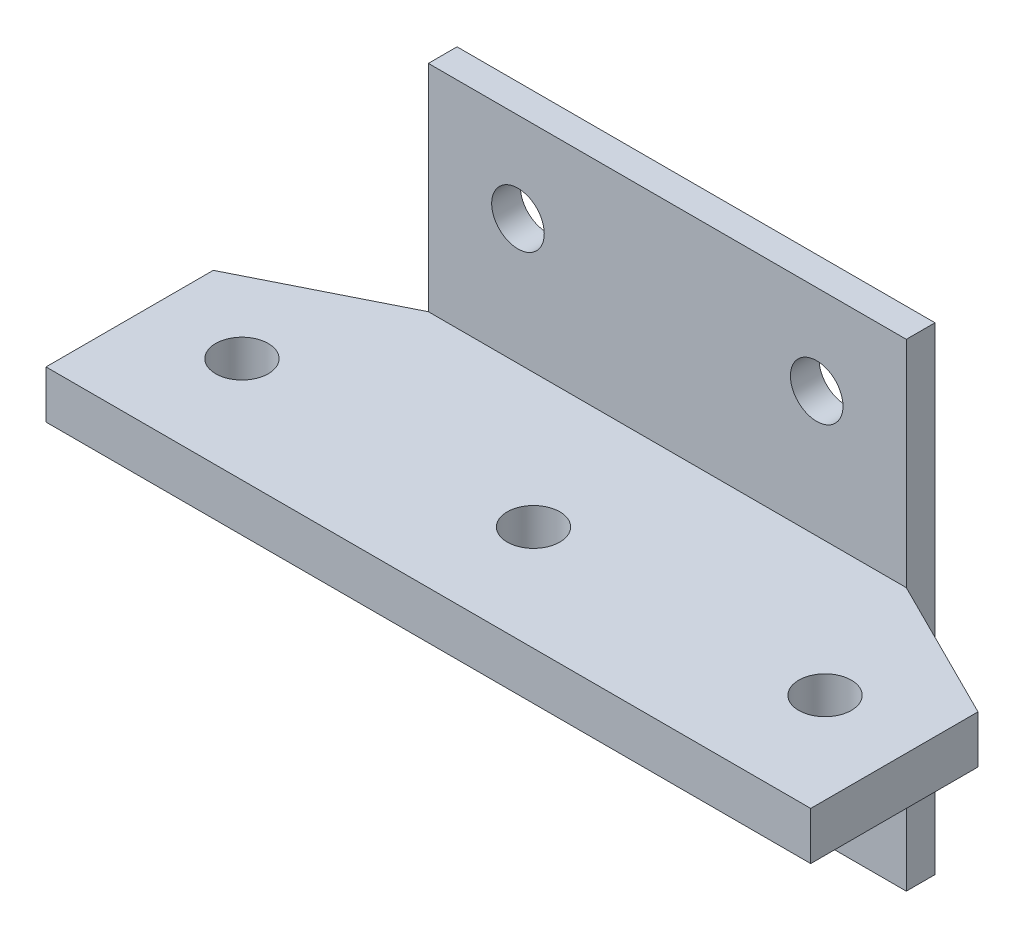
ISO-10303-21;
HEADER;
FILE_DESCRIPTION(('STEP AP214'),'2;1');
FILE_NAME('part.step','',(''),(''),'','','');
FILE_SCHEMA(('AUTOMOTIVE_DESIGN { 1 0 10303 214 1 1 1 1 }'));
ENDSEC;
DATA;
#1=APPLICATION_CONTEXT('core data for automotive mechanical design processes');
#2=APPLICATION_PROTOCOL_DEFINITION('international standard','automotive_design',2000,#1);
#3=PRODUCT_CONTEXT('',#1,'mechanical');
#4=PRODUCT('Part','Part','',(#3));
#5=PRODUCT_RELATED_PRODUCT_CATEGORY('part','',(#4));
#6=PRODUCT_DEFINITION_FORMATION('','',#4);
#7=PRODUCT_DEFINITION_CONTEXT('part definition',#1,'design');
#8=PRODUCT_DEFINITION('design','',#6,#7);
#9=PRODUCT_DEFINITION_SHAPE('','',#8);
#10=(LENGTH_UNIT() NAMED_UNIT(*) SI_UNIT(.MILLI.,.METRE.));
#11=(NAMED_UNIT(*) PLANE_ANGLE_UNIT() SI_UNIT($,.RADIAN.));
#12=(NAMED_UNIT(*) SI_UNIT($,.STERADIAN.) SOLID_ANGLE_UNIT());
#13=UNCERTAINTY_MEASURE_WITH_UNIT(LENGTH_MEASURE(1.E-05),#10,'distance_accuracy_value','');
#14=(GEOMETRIC_REPRESENTATION_CONTEXT(3) GLOBAL_UNCERTAINTY_ASSIGNED_CONTEXT((#13)) GLOBAL_UNIT_ASSIGNED_CONTEXT((#10,
#11,#12)) REPRESENTATION_CONTEXT('',''));
#15=CARTESIAN_POINT('',(0.,0.,0.));
#16=DIRECTION('',(0.,0.,1.));
#17=DIRECTION('',(1.,0.,0.));
#18=AXIS2_PLACEMENT_3D('',#15,#16,#17);
#19=CARTESIAN_POINT('',(0.,200.,12.));
#20=DIRECTION('',(0.,0.,-1.));
#21=DIRECTION('',(-1.,0.,0.));
#22=AXIS2_PLACEMENT_3D('',#19,#20,#21);
#23=PLANE('',#22);
#24=CARTESIAN_POINT('',(162.5,162.5,12.));
#25=DIRECTION('',(0.,0.,1.));
#26=DIRECTION('',(1.,0.,0.));
#27=AXIS2_PLACEMENT_3D('',#24,#25,#26);
#28=CIRCLE('',#27,11.);
#29=CARTESIAN_POINT('',(173.5,162.5,12.));
#30=VERTEX_POINT('',#29);
#31=EDGE_CURVE('E139',#30,#30,#28,.T.);
#32=ORIENTED_EDGE('',*,*,#31,.F.);
#33=EDGE_LOOP('',(#32));
#34=FACE_BOUND('',#33,.T.);
#35=CARTESIAN_POINT('',(37.5,162.5,12.));
#36=DIRECTION('',(0.,0.,1.));
#37=DIRECTION('',(1.,0.,0.));
#38=AXIS2_PLACEMENT_3D('',#35,#36,#37);
#39=CIRCLE('',#38,11.);
#40=CARTESIAN_POINT('',(48.5,162.5,12.));
#41=VERTEX_POINT('',#40);
#42=EDGE_CURVE('E180',#41,#41,#39,.T.);
#43=ORIENTED_EDGE('',*,*,#42,.F.);
#44=EDGE_LOOP('',(#43));
#45=FACE_BOUND('',#44,.T.);
#46=DIRECTION('',(-1.,0.,0.));
#47=VECTOR('',#46,1.);
#48=CARTESIAN_POINT('',(-60.,110.,12.));
#49=LINE('',#48,#47);
#50=CARTESIAN_POINT('',(200.,110.,12.));
#51=VERTEX_POINT('',#50);
#52=CARTESIAN_POINT('',(0.,110.,12.));
#53=VERTEX_POINT('',#52);
#54=EDGE_CURVE('E138',#51,#53,#49,.T.);
#55=ORIENTED_EDGE('',*,*,#54,.F.);
#56=DIRECTION('',(0.,1.,0.));
#57=VECTOR('',#56,1.);
#58=CARTESIAN_POINT('',(200.,0.,12.));
#59=LINE('',#58,#57);
#60=CARTESIAN_POINT('',(200.,200.,12.));
#61=VERTEX_POINT('',#60);
#62=EDGE_CURVE('E155',#51,#61,#59,.T.);
#63=ORIENTED_EDGE('',*,*,#62,.T.);
#64=DIRECTION('',(-1.,0.,0.));
#65=VECTOR('',#64,1.);
#66=CARTESIAN_POINT('',(0.,200.,12.));
#67=LINE('',#66,#65);
#68=CARTESIAN_POINT('',(0.,200.,12.));
#69=VERTEX_POINT('',#68);
#70=EDGE_CURVE('E159',#61,#69,#67,.T.);
#71=ORIENTED_EDGE('',*,*,#70,.T.);
#72=DIRECTION('',(0.,-1.,0.));
#73=VECTOR('',#72,1.);
#74=CARTESIAN_POINT('',(0.,0.,12.));
#75=LINE('',#74,#73);
#76=EDGE_CURVE('E117',#69,#53,#75,.T.);
#77=ORIENTED_EDGE('',*,*,#76,.T.);
#78=EDGE_LOOP('',(#55,#63,#71,#77));
#79=FACE_BOUND('',#78,.T.);
#80=ADVANCED_FACE('F33',(#34,#45,#79),#23,.F.);
#81=CARTESIAN_POINT('',(37.5,37.5,12.));
#82=DIRECTION('',(0.,0.,1.));
#83=DIRECTION('',(1.,0.,0.));
#84=AXIS2_PLACEMENT_3D('',#81,#82,#83);
#85=CIRCLE('',#84,11.);
#86=CARTESIAN_POINT('',(48.5,37.5,12.));
#87=VERTEX_POINT('',#86);
#88=EDGE_CURVE('E368',#87,#87,#85,.T.);
#89=ORIENTED_EDGE('',*,*,#88,.F.);
#90=EDGE_LOOP('',(#89));
#91=FACE_BOUND('',#90,.T.);
#92=CARTESIAN_POINT('',(162.5,37.5,12.));
#93=DIRECTION('',(0.,0.,1.));
#94=DIRECTION('',(1.,0.,0.));
#95=AXIS2_PLACEMENT_3D('',#92,#93,#94);
#96=CIRCLE('',#95,11.);
#97=CARTESIAN_POINT('',(173.5,37.5,12.));
#98=VERTEX_POINT('',#97);
#99=EDGE_CURVE('E359',#98,#98,#96,.T.);
#100=ORIENTED_EDGE('',*,*,#99,.F.);
#101=EDGE_LOOP('',(#100));
#102=FACE_BOUND('',#101,.T.);
#103=DIRECTION('',(1.,0.,0.));
#104=VECTOR('',#103,1.);
#105=CARTESIAN_POINT('',(-60.,90.,12.));
#106=LINE('',#105,#104);
#107=CARTESIAN_POINT('',(0.,90.,12.));
#108=VERTEX_POINT('',#107);
#109=CARTESIAN_POINT('',(200.,90.,12.));
#110=VERTEX_POINT('',#109);
#111=EDGE_CURVE('E127',#108,#110,#106,.T.);
#112=ORIENTED_EDGE('',*,*,#111,.F.);
#113=CARTESIAN_POINT('',(0.,0.,12.));
#114=VERTEX_POINT('',#113);
#115=EDGE_CURVE('E118',#108,#114,#75,.T.);
#116=ORIENTED_EDGE('',*,*,#115,.T.);
#117=DIRECTION('',(1.,0.,0.));
#118=VECTOR('',#117,1.);
#119=CARTESIAN_POINT('',(0.,0.,12.));
#120=LINE('',#119,#118);
#121=CARTESIAN_POINT('',(200.,0.,12.));
#122=VERTEX_POINT('',#121);
#123=EDGE_CURVE('E151',#114,#122,#120,.T.);
#124=ORIENTED_EDGE('',*,*,#123,.T.);
#125=EDGE_CURVE('E137',#122,#110,#59,.T.);
#126=ORIENTED_EDGE('',*,*,#125,.T.);
#127=EDGE_LOOP('',(#112,#116,#124,#126));
#128=FACE_BOUND('',#127,.T.);
#129=ADVANCED_FACE('F134',(#91,#102,#128),#23,.F.);
#130=CARTESIAN_POINT('',(0.,0.,12.));
#131=DIRECTION('',(1.,0.,0.));
#132=DIRECTION('',(0.,0.,-1.));
#133=AXIS2_PLACEMENT_3D('',#130,#131,#132);
#134=PLANE('',#133);
#135=DIRECTION('',(0.,-1.,0.));
#136=VECTOR('',#135,1.);
#137=CARTESIAN_POINT('',(0.,0.,0.));
#138=LINE('',#137,#136);
#139=CARTESIAN_POINT('',(0.,200.,0.));
#140=VERTEX_POINT('',#139);
#141=CARTESIAN_POINT('',(0.,0.,0.));
#142=VERTEX_POINT('',#141);
#143=EDGE_CURVE('E162',#140,#142,#138,.T.);
#144=ORIENTED_EDGE('',*,*,#143,.T.);
#145=DIRECTION('',(0.,0.,-1.));
#146=VECTOR('',#145,1.);
#147=CARTESIAN_POINT('',(0.,0.,12.));
#148=LINE('',#147,#146);
#149=EDGE_CURVE('E145',#114,#142,#148,.T.);
#150=ORIENTED_EDGE('',*,*,#149,.F.);
#151=ORIENTED_EDGE('',*,*,#115,.F.);
#152=EDGE_CURVE('E108',#53,#108,#75,.T.);
#153=ORIENTED_EDGE('',*,*,#152,.F.);
#154=ORIENTED_EDGE('',*,*,#76,.F.);
#155=DIRECTION('',(0.,0.,-1.));
#156=VECTOR('',#155,1.);
#157=CARTESIAN_POINT('',(0.,200.,12.));
#158=LINE('',#157,#156);
#159=EDGE_CURVE('E161',#69,#140,#158,.T.);
#160=ORIENTED_EDGE('',*,*,#159,.T.);
#161=EDGE_LOOP('',(#144,#150,#151,#153,#154,#160));
#162=FACE_BOUND('',#161,.T.);
#163=ADVANCED_FACE('F143',(#162),#134,.F.);
#164=CARTESIAN_POINT('',(0.,0.,12.));
#165=DIRECTION('',(0.,1.,0.));
#166=DIRECTION('',(0.,0.,1.));
#167=AXIS2_PLACEMENT_3D('',#164,#165,#166);
#168=PLANE('',#167);
#169=DIRECTION('',(1.,0.,0.));
#170=VECTOR('',#169,1.);
#171=CARTESIAN_POINT('',(0.,0.,0.));
#172=LINE('',#171,#170);
#173=CARTESIAN_POINT('',(200.,0.,0.));
#174=VERTEX_POINT('',#173);
#175=EDGE_CURVE('E164',#142,#174,#172,.T.);
#176=ORIENTED_EDGE('',*,*,#175,.T.);
#177=DIRECTION('',(0.,0.,-1.));
#178=VECTOR('',#177,1.);
#179=CARTESIAN_POINT('',(200.,0.,12.));
#180=LINE('',#179,#178);
#181=EDGE_CURVE('E173',#122,#174,#180,.T.);
#182=ORIENTED_EDGE('',*,*,#181,.F.);
#183=ORIENTED_EDGE('',*,*,#123,.F.);
#184=ORIENTED_EDGE('',*,*,#149,.T.);
#185=EDGE_LOOP('',(#176,#182,#183,#184));
#186=FACE_BOUND('',#185,.T.);
#187=ADVANCED_FACE('F238',(#186),#168,.F.);
#188=CARTESIAN_POINT('',(200.,0.,12.));
#189=DIRECTION('',(-1.,0.,0.));
#190=DIRECTION('',(0.,0.,1.));
#191=AXIS2_PLACEMENT_3D('',#188,#189,#190);
#192=PLANE('',#191);
#193=DIRECTION('',(0.,1.,0.));
#194=VECTOR('',#193,1.);
#195=CARTESIAN_POINT('',(200.,0.,0.));
#196=LINE('',#195,#194);
#197=CARTESIAN_POINT('',(200.,200.,0.));
#198=VERTEX_POINT('',#197);
#199=EDGE_CURVE('E147',#174,#198,#196,.T.);
#200=ORIENTED_EDGE('',*,*,#199,.T.);
#201=DIRECTION('',(0.,0.,-1.));
#202=VECTOR('',#201,1.);
#203=CARTESIAN_POINT('',(200.,200.,12.));
#204=LINE('',#203,#202);
#205=EDGE_CURVE('E170',#61,#198,#204,.T.);
#206=ORIENTED_EDGE('',*,*,#205,.F.);
#207=ORIENTED_EDGE('',*,*,#62,.F.);
#208=EDGE_CURVE('E56',#110,#51,#59,.T.);
#209=ORIENTED_EDGE('',*,*,#208,.F.);
#210=ORIENTED_EDGE('',*,*,#125,.F.);
#211=ORIENTED_EDGE('',*,*,#181,.T.);
#212=EDGE_LOOP('',(#200,#206,#207,#209,#210,#211));
#213=FACE_BOUND('',#212,.T.);
#214=ADVANCED_FACE('F234',(#213),#192,.F.);
#215=CARTESIAN_POINT('',(0.,200.,12.));
#216=DIRECTION('',(0.,-1.,0.));
#217=DIRECTION('',(0.,0.,-1.));
#218=AXIS2_PLACEMENT_3D('',#215,#216,#217);
#219=PLANE('',#218);
#220=DIRECTION('',(-1.,0.,0.));
#221=VECTOR('',#220,1.);
#222=CARTESIAN_POINT('',(0.,200.,0.));
#223=LINE('',#222,#221);
#224=EDGE_CURVE('E146',#198,#140,#223,.T.);
#225=ORIENTED_EDGE('',*,*,#224,.T.);
#226=ORIENTED_EDGE('',*,*,#159,.F.);
#227=ORIENTED_EDGE('',*,*,#70,.F.);
#228=ORIENTED_EDGE('',*,*,#205,.T.);
#229=EDGE_LOOP('',(#225,#226,#227,#228));
#230=FACE_BOUND('',#229,.T.);
#231=ADVANCED_FACE('F230',(#230),#219,.F.);
#232=CARTESIAN_POINT('',(0.,200.,0.));
#233=DIRECTION('',(0.,0.,-1.));
#234=DIRECTION('',(-1.,0.,0.));
#235=AXIS2_PLACEMENT_3D('',#232,#233,#234);
#236=PLANE('',#235);
#237=CARTESIAN_POINT('',(162.5,37.5,0.));
#238=DIRECTION('',(0.,0.,1.));
#239=DIRECTION('',(1.,0.,0.));
#240=AXIS2_PLACEMENT_3D('',#237,#238,#239);
#241=CIRCLE('',#240,11.);
#242=CARTESIAN_POINT('',(173.5,37.5,0.));
#243=VERTEX_POINT('',#242);
#244=EDGE_CURVE('E355',#243,#243,#241,.T.);
#245=ORIENTED_EDGE('',*,*,#244,.T.);
#246=EDGE_LOOP('',(#245));
#247=FACE_BOUND('',#246,.T.);
#248=CARTESIAN_POINT('',(37.5,37.5,0.));
#249=DIRECTION('',(0.,0.,1.));
#250=DIRECTION('',(1.,0.,0.));
#251=AXIS2_PLACEMENT_3D('',#248,#249,#250);
#252=CIRCLE('',#251,11.);
#253=CARTESIAN_POINT('',(48.5,37.5,0.));
#254=VERTEX_POINT('',#253);
#255=EDGE_CURVE('E165',#254,#254,#252,.T.);
#256=ORIENTED_EDGE('',*,*,#255,.T.);
#257=EDGE_LOOP('',(#256));
#258=FACE_BOUND('',#257,.T.);
#259=ORIENTED_EDGE('',*,*,#143,.F.);
#260=ORIENTED_EDGE('',*,*,#224,.F.);
#261=ORIENTED_EDGE('',*,*,#199,.F.);
#262=ORIENTED_EDGE('',*,*,#175,.F.);
#263=EDGE_LOOP('',(#259,#260,#261,#262));
#264=FACE_BOUND('',#263,.T.);
#265=CARTESIAN_POINT('',(37.5,162.5,0.));
#266=DIRECTION('',(0.,0.,1.));
#267=DIRECTION('',(1.,0.,0.));
#268=AXIS2_PLACEMENT_3D('',#265,#266,#267);
#269=CIRCLE('',#268,11.);
#270=CARTESIAN_POINT('',(48.5,162.5,0.));
#271=VERTEX_POINT('',#270);
#272=EDGE_CURVE('E177',#271,#271,#269,.T.);
#273=ORIENTED_EDGE('',*,*,#272,.T.);
#274=EDGE_LOOP('',(#273));
#275=FACE_BOUND('',#274,.T.);
#276=CARTESIAN_POINT('',(162.5,162.5,0.));
#277=DIRECTION('',(0.,0.,1.));
#278=DIRECTION('',(1.,0.,0.));
#279=AXIS2_PLACEMENT_3D('',#276,#277,#278);
#280=CIRCLE('',#279,11.);
#281=CARTESIAN_POINT('',(173.5,162.5,0.));
#282=VERTEX_POINT('',#281);
#283=EDGE_CURVE('E183',#282,#282,#280,.T.);
#284=ORIENTED_EDGE('',*,*,#283,.T.);
#285=EDGE_LOOP('',(#284));
#286=FACE_BOUND('',#285,.T.);
#287=ADVANCED_FACE('F227',(#247,#258,#264,#275,#286),#236,.T.);
#288=CARTESIAN_POINT('',(37.5,37.5,0.));
#289=DIRECTION('',(0.,0.,1.));
#290=DIRECTION('',(1.,0.,0.));
#291=AXIS2_PLACEMENT_3D('',#288,#289,#290);
#292=CYLINDRICAL_SURFACE('',#291,11.);
#293=ORIENTED_EDGE('',*,*,#255,.F.);
#294=EDGE_LOOP('',(#293));
#295=FACE_BOUND('',#294,.T.);
#296=ORIENTED_EDGE('',*,*,#88,.T.);
#297=EDGE_LOOP('',(#296));
#298=FACE_BOUND('',#297,.T.);
#299=ADVANCED_FACE('F225',(#295,#298),#292,.F.);
#300=CARTESIAN_POINT('',(162.5,37.5,0.));
#301=DIRECTION('',(0.,0.,1.));
#302=DIRECTION('',(1.,0.,0.));
#303=AXIS2_PLACEMENT_3D('',#300,#301,#302);
#304=CYLINDRICAL_SURFACE('',#303,11.);
#305=ORIENTED_EDGE('',*,*,#244,.F.);
#306=EDGE_LOOP('',(#305));
#307=FACE_BOUND('',#306,.T.);
#308=ORIENTED_EDGE('',*,*,#99,.T.);
#309=EDGE_LOOP('',(#308));
#310=FACE_BOUND('',#309,.T.);
#311=ADVANCED_FACE('F247',(#307,#310),#304,.F.);
#312=CARTESIAN_POINT('',(37.5,162.5,0.));
#313=DIRECTION('',(0.,0.,1.));
#314=DIRECTION('',(1.,0.,0.));
#315=AXIS2_PLACEMENT_3D('',#312,#313,#314);
#316=CYLINDRICAL_SURFACE('',#315,11.);
#317=ORIENTED_EDGE('',*,*,#272,.F.);
#318=EDGE_LOOP('',(#317));
#319=FACE_BOUND('',#318,.T.);
#320=ORIENTED_EDGE('',*,*,#42,.T.);
#321=EDGE_LOOP('',(#320));
#322=FACE_BOUND('',#321,.T.);
#323=ADVANCED_FACE('F245',(#319,#322),#316,.F.);
#324=CARTESIAN_POINT('',(162.5,162.5,0.));
#325=DIRECTION('',(0.,0.,1.));
#326=DIRECTION('',(1.,0.,0.));
#327=AXIS2_PLACEMENT_3D('',#324,#325,#326);
#328=CYLINDRICAL_SURFACE('',#327,11.);
#329=ORIENTED_EDGE('',*,*,#283,.F.);
#330=EDGE_LOOP('',(#329));
#331=FACE_BOUND('',#330,.T.);
#332=ORIENTED_EDGE('',*,*,#31,.T.);
#333=EDGE_LOOP('',(#332));
#334=FACE_BOUND('',#333,.T.);
#335=ADVANCED_FACE('F209',(#331,#334),#328,.F.);
#336=CARTESIAN_POINT('',(-60.,110.,112.));
#337=DIRECTION('',(1.,0.,0.));
#338=DIRECTION('',(0.,0.,-1.));
#339=AXIS2_PLACEMENT_3D('',#336,#337,#338);
#340=PLANE('',#339);
#341=DIRECTION('',(0.,0.,-1.));
#342=VECTOR('',#341,1.);
#343=CARTESIAN_POINT('',(-60.,110.,112.));
#344=LINE('',#343,#342);
#345=CARTESIAN_POINT('',(-60.,110.,112.));
#346=VERTEX_POINT('',#345);
#347=CARTESIAN_POINT('',(-60.,110.,42.));
#348=VERTEX_POINT('',#347);
#349=EDGE_CURVE('E400',#346,#348,#344,.T.);
#350=ORIENTED_EDGE('',*,*,#349,.T.);
#351=DIRECTION('',(0.,-1.,0.));
#352=VECTOR('',#351,1.);
#353=CARTESIAN_POINT('',(-60.,200.,42.));
#354=LINE('',#353,#352);
#355=CARTESIAN_POINT('',(-60.,90.,42.));
#356=VERTEX_POINT('',#355);
#357=EDGE_CURVE('E48',#348,#356,#354,.T.);
#358=ORIENTED_EDGE('',*,*,#357,.T.);
#359=DIRECTION('',(0.,0.,-1.));
#360=VECTOR('',#359,1.);
#361=CARTESIAN_POINT('',(-60.,90.,112.));
#362=LINE('',#361,#360);
#363=CARTESIAN_POINT('',(-60.,90.,112.));
#364=VERTEX_POINT('',#363);
#365=EDGE_CURVE('E129',#364,#356,#362,.T.);
#366=ORIENTED_EDGE('',*,*,#365,.F.);
#367=DIRECTION('',(0.,-1.,0.));
#368=VECTOR('',#367,1.);
#369=CARTESIAN_POINT('',(-60.,110.,112.));
#370=LINE('',#369,#368);
#371=EDGE_CURVE('E346',#346,#364,#370,.T.);
#372=ORIENTED_EDGE('',*,*,#371,.F.);
#373=EDGE_LOOP('',(#350,#358,#366,#372));
#374=FACE_BOUND('',#373,.T.);
#375=ADVANCED_FACE('F199',(#374),#340,.F.);
#376=CARTESIAN_POINT('',(-60.,90.,112.));
#377=DIRECTION('',(0.,1.,0.));
#378=DIRECTION('',(0.,0.,1.));
#379=AXIS2_PLACEMENT_3D('',#376,#377,#378);
#380=PLANE('',#379);
#381=CARTESIAN_POINT('',(100.,90.,68.));
#382=DIRECTION('',(0.,-1.,0.));
#383=DIRECTION('',(0.,0.,-1.));
#384=AXIS2_PLACEMENT_3D('',#381,#382,#383);
#385=CIRCLE('',#384,11.);
#386=CARTESIAN_POINT('',(100.,90.,57.));
#387=VERTEX_POINT('',#386);
#388=EDGE_CURVE('E419',#387,#387,#385,.T.);
#389=ORIENTED_EDGE('',*,*,#388,.F.);
#390=EDGE_LOOP('',(#389));
#391=FACE_BOUND('',#390,.T.);
#392=CARTESIAN_POINT('',(-22.,90.,68.));
#393=DIRECTION('',(0.,-1.,0.));
#394=DIRECTION('',(0.,0.,-1.));
#395=AXIS2_PLACEMENT_3D('',#392,#393,#394);
#396=CIRCLE('',#395,11.);
#397=CARTESIAN_POINT('',(-22.,90.,57.));
#398=VERTEX_POINT('',#397);
#399=EDGE_CURVE('E192',#398,#398,#396,.T.);
#400=ORIENTED_EDGE('',*,*,#399,.F.);
#401=EDGE_LOOP('',(#400));
#402=FACE_BOUND('',#401,.T.);
#403=ORIENTED_EDGE('',*,*,#365,.T.);
#404=DIRECTION('',(-0.894427190999916,0.,0.447213595499958));
#405=VECTOR('',#404,1.);
#406=CARTESIAN_POINT('',(-60.,90.,42.));
#407=LINE('',#406,#405);
#408=EDGE_CURVE('E111',#108,#356,#407,.T.);
#409=ORIENTED_EDGE('',*,*,#408,.F.);
#410=ORIENTED_EDGE('',*,*,#111,.T.);
#411=DIRECTION('',(-0.894427190999916,0.,-0.447213595499958));
#412=VECTOR('',#411,1.);
#413=CARTESIAN_POINT('',(200.,90.,12.));
#414=LINE('',#413,#412);
#415=CARTESIAN_POINT('',(260.,90.,42.));
#416=VERTEX_POINT('',#415);
#417=EDGE_CURVE('E407',#416,#110,#414,.T.);
#418=ORIENTED_EDGE('',*,*,#417,.F.);
#419=DIRECTION('',(0.,0.,-1.));
#420=VECTOR('',#419,1.);
#421=CARTESIAN_POINT('',(260.,90.,112.));
#422=LINE('',#421,#420);
#423=CARTESIAN_POINT('',(260.,90.,112.));
#424=VERTEX_POINT('',#423);
#425=EDGE_CURVE('E356',#424,#416,#422,.T.);
#426=ORIENTED_EDGE('',*,*,#425,.F.);
#427=DIRECTION('',(1.,0.,0.));
#428=VECTOR('',#427,1.);
#429=CARTESIAN_POINT('',(-60.,90.,112.));
#430=LINE('',#429,#428);
#431=EDGE_CURVE('E347',#364,#424,#430,.T.);
#432=ORIENTED_EDGE('',*,*,#431,.F.);
#433=EDGE_LOOP('',(#403,#409,#410,#418,#426,#432));
#434=FACE_BOUND('',#433,.T.);
#435=CARTESIAN_POINT('',(222.,90.,68.));
#436=DIRECTION('',(0.,-1.,0.));
#437=DIRECTION('',(0.,0.,-1.));
#438=AXIS2_PLACEMENT_3D('',#435,#436,#437);
#439=CIRCLE('',#438,11.);
#440=CARTESIAN_POINT('',(222.,90.,57.));
#441=VERTEX_POINT('',#440);
#442=EDGE_CURVE('E41',#441,#441,#439,.T.);
#443=ORIENTED_EDGE('',*,*,#442,.F.);
#444=EDGE_LOOP('',(#443));
#445=FACE_BOUND('',#444,.T.);
#446=ADVANCED_FACE('F124',(#391,#402,#434,#445),#380,.F.);
#447=CARTESIAN_POINT('',(260.,110.,112.));
#448=DIRECTION('',(-1.,0.,0.));
#449=DIRECTION('',(0.,0.,1.));
#450=AXIS2_PLACEMENT_3D('',#447,#448,#449);
#451=PLANE('',#450);
#452=ORIENTED_EDGE('',*,*,#425,.T.);
#453=DIRECTION('',(0.,-1.,0.));
#454=VECTOR('',#453,1.);
#455=CARTESIAN_POINT('',(260.,200.,42.));
#456=LINE('',#455,#454);
#457=CARTESIAN_POINT('',(260.,110.,42.));
#458=VERTEX_POINT('',#457);
#459=EDGE_CURVE('E353',#458,#416,#456,.T.);
#460=ORIENTED_EDGE('',*,*,#459,.F.);
#461=DIRECTION('',(0.,0.,-1.));
#462=VECTOR('',#461,1.);
#463=CARTESIAN_POINT('',(260.,110.,112.));
#464=LINE('',#463,#462);
#465=CARTESIAN_POINT('',(260.,110.,112.));
#466=VERTEX_POINT('',#465);
#467=EDGE_CURVE('E362',#466,#458,#464,.T.);
#468=ORIENTED_EDGE('',*,*,#467,.F.);
#469=DIRECTION('',(0.,1.,0.));
#470=VECTOR('',#469,1.);
#471=CARTESIAN_POINT('',(260.,110.,112.));
#472=LINE('',#471,#470);
#473=EDGE_CURVE('E406',#424,#466,#472,.T.);
#474=ORIENTED_EDGE('',*,*,#473,.F.);
#475=EDGE_LOOP('',(#452,#460,#468,#474));
#476=FACE_BOUND('',#475,.T.);
#477=ADVANCED_FACE('F198',(#476),#451,.F.);
#478=CARTESIAN_POINT('',(-60.,110.,112.));
#479=DIRECTION('',(0.,-1.,0.));
#480=DIRECTION('',(0.,0.,-1.));
#481=AXIS2_PLACEMENT_3D('',#478,#479,#480);
#482=PLANE('',#481);
#483=CARTESIAN_POINT('',(100.,110.,68.));
#484=DIRECTION('',(0.,-1.,0.));
#485=DIRECTION('',(0.,0.,-1.));
#486=AXIS2_PLACEMENT_3D('',#483,#484,#485);
#487=CIRCLE('',#486,11.);
#488=CARTESIAN_POINT('',(100.,110.,57.));
#489=VERTEX_POINT('',#488);
#490=EDGE_CURVE('E416',#489,#489,#487,.T.);
#491=ORIENTED_EDGE('',*,*,#490,.T.);
#492=EDGE_LOOP('',(#491));
#493=FACE_BOUND('',#492,.T.);
#494=CARTESIAN_POINT('',(-22.,110.,68.));
#495=DIRECTION('',(0.,-1.,0.));
#496=DIRECTION('',(0.,0.,-1.));
#497=AXIS2_PLACEMENT_3D('',#494,#495,#496);
#498=CIRCLE('',#497,11.);
#499=CARTESIAN_POINT('',(-22.,110.,57.));
#500=VERTEX_POINT('',#499);
#501=EDGE_CURVE('E130',#500,#500,#498,.T.);
#502=ORIENTED_EDGE('',*,*,#501,.T.);
#503=EDGE_LOOP('',(#502));
#504=FACE_BOUND('',#503,.T.);
#505=ORIENTED_EDGE('',*,*,#54,.T.);
#506=DIRECTION('',(-0.894427190999916,0.,0.447213595499958));
#507=VECTOR('',#506,1.);
#508=CARTESIAN_POINT('',(-88.,110.,56.));
#509=LINE('',#508,#507);
#510=EDGE_CURVE('E112',#53,#348,#509,.T.);
#511=ORIENTED_EDGE('',*,*,#510,.T.);
#512=ORIENTED_EDGE('',*,*,#349,.F.);
#513=DIRECTION('',(-1.,0.,0.));
#514=VECTOR('',#513,1.);
#515=CARTESIAN_POINT('',(-60.,110.,112.));
#516=LINE('',#515,#514);
#517=EDGE_CURVE('E350',#466,#346,#516,.T.);
#518=ORIENTED_EDGE('',*,*,#517,.F.);
#519=ORIENTED_EDGE('',*,*,#467,.T.);
#520=DIRECTION('',(-0.894427190999916,0.,-0.447213595499958));
#521=VECTOR('',#520,1.);
#522=CARTESIAN_POINT('',(31.9999999999999,110.,-72.));
#523=LINE('',#522,#521);
#524=EDGE_CURVE('E188',#458,#51,#523,.T.);
#525=ORIENTED_EDGE('',*,*,#524,.T.);
#526=EDGE_LOOP('',(#505,#511,#512,#518,#519,#525));
#527=FACE_BOUND('',#526,.T.);
#528=CARTESIAN_POINT('',(222.,110.,68.));
#529=DIRECTION('',(0.,-1.,0.));
#530=DIRECTION('',(0.,0.,-1.));
#531=AXIS2_PLACEMENT_3D('',#528,#529,#530);
#532=CIRCLE('',#531,11.);
#533=CARTESIAN_POINT('',(222.,110.,57.));
#534=VERTEX_POINT('',#533);
#535=EDGE_CURVE('E11',#534,#534,#532,.T.);
#536=ORIENTED_EDGE('',*,*,#535,.T.);
#537=EDGE_LOOP('',(#536));
#538=FACE_BOUND('',#537,.T.);
#539=ADVANCED_FACE('F206',(#493,#504,#527,#538),#482,.F.);
#540=CARTESIAN_POINT('',(-60.,90.,112.));
#541=DIRECTION('',(0.,0.,1.));
#542=DIRECTION('',(1.,0.,0.));
#543=AXIS2_PLACEMENT_3D('',#540,#541,#542);
#544=PLANE('',#543);
#545=ORIENTED_EDGE('',*,*,#371,.T.);
#546=ORIENTED_EDGE('',*,*,#431,.T.);
#547=ORIENTED_EDGE('',*,*,#473,.T.);
#548=ORIENTED_EDGE('',*,*,#517,.T.);
#549=EDGE_LOOP('',(#545,#546,#547,#548));
#550=FACE_BOUND('',#549,.T.);
#551=ADVANCED_FACE('F288',(#550),#544,.T.);
#552=CARTESIAN_POINT('',(200.,200.,12.));
#553=DIRECTION('',(-0.447213595499958,0.,0.894427190999916));
#554=DIRECTION('',(0.894427190999916,0.,0.447213595499958));
#555=AXIS2_PLACEMENT_3D('',#552,#553,#554);
#556=PLANE('',#555);
#557=ORIENTED_EDGE('',*,*,#459,.T.);
#558=ORIENTED_EDGE('',*,*,#417,.T.);
#559=ORIENTED_EDGE('',*,*,#208,.T.);
#560=ORIENTED_EDGE('',*,*,#524,.F.);
#561=EDGE_LOOP('',(#557,#558,#559,#560));
#562=FACE_BOUND('',#561,.T.);
#563=ADVANCED_FACE('F283',(#562),#556,.F.);
#564=CARTESIAN_POINT('',(-60.,200.,42.));
#565=DIRECTION('',(0.447213595499958,0.,0.894427190999916));
#566=DIRECTION('',(0.894427190999916,0.,-0.447213595499958));
#567=AXIS2_PLACEMENT_3D('',#564,#565,#566);
#568=PLANE('',#567);
#569=ORIENTED_EDGE('',*,*,#152,.T.);
#570=ORIENTED_EDGE('',*,*,#408,.T.);
#571=ORIENTED_EDGE('',*,*,#357,.F.);
#572=ORIENTED_EDGE('',*,*,#510,.F.);
#573=EDGE_LOOP('',(#569,#570,#571,#572));
#574=FACE_BOUND('',#573,.T.);
#575=ADVANCED_FACE('F110',(#574),#568,.F.);
#576=CARTESIAN_POINT('',(-22.,200.,68.));
#577=DIRECTION('',(0.,-1.,0.));
#578=DIRECTION('',(0.,0.,-1.));
#579=AXIS2_PLACEMENT_3D('',#576,#577,#578);
#580=CYLINDRICAL_SURFACE('',#579,11.);
#581=ORIENTED_EDGE('',*,*,#399,.T.);
#582=EDGE_LOOP('',(#581));
#583=FACE_BOUND('',#582,.T.);
#584=ORIENTED_EDGE('',*,*,#501,.F.);
#585=EDGE_LOOP('',(#584));
#586=FACE_BOUND('',#585,.T.);
#587=ADVANCED_FACE('F299',(#583,#586),#580,.F.);
#588=CARTESIAN_POINT('',(100.,200.,68.));
#589=DIRECTION('',(0.,-1.,0.));
#590=DIRECTION('',(0.,0.,-1.));
#591=AXIS2_PLACEMENT_3D('',#588,#589,#590);
#592=CYLINDRICAL_SURFACE('',#591,11.);
#593=ORIENTED_EDGE('',*,*,#388,.T.);
#594=EDGE_LOOP('',(#593));
#595=FACE_BOUND('',#594,.T.);
#596=ORIENTED_EDGE('',*,*,#490,.F.);
#597=EDGE_LOOP('',(#596));
#598=FACE_BOUND('',#597,.T.);
#599=ADVANCED_FACE('F307',(#595,#598),#592,.F.);
#600=CARTESIAN_POINT('',(222.,200.,68.));
#601=DIRECTION('',(0.,-1.,0.));
#602=DIRECTION('',(0.,0.,-1.));
#603=AXIS2_PLACEMENT_3D('',#600,#601,#602);
#604=CYLINDRICAL_SURFACE('',#603,11.);
#605=ORIENTED_EDGE('',*,*,#442,.T.);
#606=EDGE_LOOP('',(#605));
#607=FACE_BOUND('',#606,.T.);
#608=ORIENTED_EDGE('',*,*,#535,.F.);
#609=EDGE_LOOP('',(#608));
#610=FACE_BOUND('',#609,.T.);
#611=ADVANCED_FACE('F35',(#607,#610),#604,.F.);
#612=CLOSED_SHELL('',(#80,#129,#163,#187,#214,#231,#287,#299,#311,#323,#335,#375,#446,#477,#539,
#551,#563,#575,#587,#599,#611));
#613=MANIFOLD_SOLID_BREP('B2',#612);
#614=ADVANCED_BREP_SHAPE_REPRESENTATION('',(#18,#613),#14);
#615=SHAPE_DEFINITION_REPRESENTATION(#9,#614);
ENDSEC;
END-ISO-10303-21;
